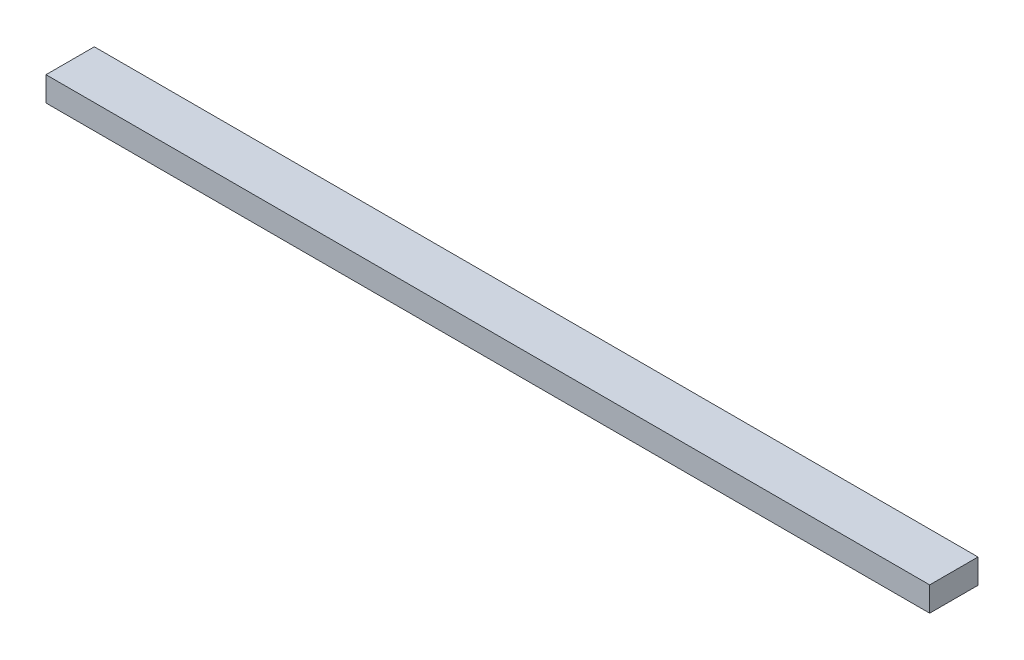
ISO-10303-21;
HEADER;
FILE_DESCRIPTION(('STEP AP214'),'2;1');
FILE_NAME('part.step','',(''),(''),'','','');
FILE_SCHEMA(('AUTOMOTIVE_DESIGN { 1 0 10303 214 1 1 1 1 }'));
ENDSEC;
DATA;
#1=APPLICATION_CONTEXT('core data for automotive mechanical design processes');
#2=APPLICATION_PROTOCOL_DEFINITION('international standard','automotive_design',2000,#1);
#3=PRODUCT_CONTEXT('',#1,'mechanical');
#4=PRODUCT('Part','Part','',(#3));
#5=PRODUCT_RELATED_PRODUCT_CATEGORY('part','',(#4));
#6=PRODUCT_DEFINITION_FORMATION('','',#4);
#7=PRODUCT_DEFINITION_CONTEXT('part definition',#1,'design');
#8=PRODUCT_DEFINITION('design','',#6,#7);
#9=PRODUCT_DEFINITION_SHAPE('','',#8);
#10=(LENGTH_UNIT() NAMED_UNIT(*) SI_UNIT(.MILLI.,.METRE.));
#11=(NAMED_UNIT(*) PLANE_ANGLE_UNIT() SI_UNIT($,.RADIAN.));
#12=(NAMED_UNIT(*) SI_UNIT($,.STERADIAN.) SOLID_ANGLE_UNIT());
#13=UNCERTAINTY_MEASURE_WITH_UNIT(LENGTH_MEASURE(1.E-05),#10,'distance_accuracy_value','');
#14=(GEOMETRIC_REPRESENTATION_CONTEXT(3) GLOBAL_UNCERTAINTY_ASSIGNED_CONTEXT((#13)) GLOBAL_UNIT_ASSIGNED_CONTEXT((#10,
#11,#12)) REPRESENTATION_CONTEXT('',''));
#15=CARTESIAN_POINT('',(0.,0.,0.));
#16=DIRECTION('',(0.,0.,1.));
#17=DIRECTION('',(1.,0.,0.));
#18=AXIS2_PLACEMENT_3D('',#15,#16,#17);
#19=CARTESIAN_POINT('',(-0.254,-0.254,1.));
#20=DIRECTION('',(1.,0.,0.));
#21=DIRECTION('',(0.,0.,-1.));
#22=AXIS2_PLACEMENT_3D('',#19,#20,#21);
#23=PLANE('',#22);
#24=DIRECTION('',(0.,-1.,0.));
#25=VECTOR('',#24,1.);
#26=CARTESIAN_POINT('',(-0.254,-0.254,0.));
#27=LINE('',#26,#25);
#28=CARTESIAN_POINT('',(-0.254,0.254,0.));
#29=VERTEX_POINT('',#28);
#30=CARTESIAN_POINT('',(-0.254,-0.254,0.));
#31=VERTEX_POINT('',#30);
#32=EDGE_CURVE('E95',#29,#31,#27,.T.);
#33=ORIENTED_EDGE('',*,*,#32,.T.);
#34=DIRECTION('',(0.,0.,-1.));
#35=VECTOR('',#34,1.);
#36=CARTESIAN_POINT('',(-0.254,-0.254,1.));
#37=LINE('',#36,#35);
#38=CARTESIAN_POINT('',(-0.254,-0.254,1.));
#39=VERTEX_POINT('',#38);
#40=EDGE_CURVE('E11',#39,#31,#37,.T.);
#41=ORIENTED_EDGE('',*,*,#40,.F.);
#42=DIRECTION('',(0.,-1.,0.));
#43=VECTOR('',#42,1.);
#44=CARTESIAN_POINT('',(-0.254,-0.254,1.));
#45=LINE('',#44,#43);
#46=CARTESIAN_POINT('',(-0.254,0.254,1.));
#47=VERTEX_POINT('',#46);
#48=EDGE_CURVE('E83',#47,#39,#45,.T.);
#49=ORIENTED_EDGE('',*,*,#48,.F.);
#50=DIRECTION('',(0.,0.,-1.));
#51=VECTOR('',#50,1.);
#52=CARTESIAN_POINT('',(-0.254,0.254,1.));
#53=LINE('',#52,#51);
#54=EDGE_CURVE('E91',#47,#29,#53,.T.);
#55=ORIENTED_EDGE('',*,*,#54,.T.);
#56=EDGE_LOOP('',(#33,#41,#49,#55));
#57=FACE_BOUND('',#56,.T.);
#58=ADVANCED_FACE('F32',(#57),#23,.F.);
#59=CARTESIAN_POINT('',(18.034,-0.254,1.));
#60=DIRECTION('',(0.,1.,0.));
#61=DIRECTION('',(0.,0.,1.));
#62=AXIS2_PLACEMENT_3D('',#59,#60,#61);
#63=PLANE('',#62);
#64=DIRECTION('',(1.,0.,0.));
#65=VECTOR('',#64,1.);
#66=CARTESIAN_POINT('',(18.034,-0.254,0.));
#67=LINE('',#66,#65);
#68=CARTESIAN_POINT('',(18.034,-0.254,0.));
#69=VERTEX_POINT('',#68);
#70=EDGE_CURVE('E87',#31,#69,#67,.T.);
#71=ORIENTED_EDGE('',*,*,#70,.T.);
#72=DIRECTION('',(0.,0.,-1.));
#73=VECTOR('',#72,1.);
#74=CARTESIAN_POINT('',(18.034,-0.254,1.));
#75=LINE('',#74,#73);
#76=CARTESIAN_POINT('',(18.034,-0.254,1.));
#77=VERTEX_POINT('',#76);
#78=EDGE_CURVE('E40',#77,#69,#75,.T.);
#79=ORIENTED_EDGE('',*,*,#78,.F.);
#80=DIRECTION('',(1.,0.,0.));
#81=VECTOR('',#80,1.);
#82=CARTESIAN_POINT('',(18.034,-0.254,1.));
#83=LINE('',#82,#81);
#84=EDGE_CURVE('E78',#39,#77,#83,.T.);
#85=ORIENTED_EDGE('',*,*,#84,.F.);
#86=ORIENTED_EDGE('',*,*,#40,.T.);
#87=EDGE_LOOP('',(#71,#79,#85,#86));
#88=FACE_BOUND('',#87,.T.);
#89=ADVANCED_FACE('F86',(#88),#63,.F.);
#90=CARTESIAN_POINT('',(18.034,0.254,1.));
#91=DIRECTION('',(-1.,0.,0.));
#92=DIRECTION('',(0.,0.,1.));
#93=AXIS2_PLACEMENT_3D('',#90,#91,#92);
#94=PLANE('',#93);
#95=DIRECTION('',(0.,1.,0.));
#96=VECTOR('',#95,1.);
#97=CARTESIAN_POINT('',(18.034,0.254,0.));
#98=LINE('',#97,#96);
#99=CARTESIAN_POINT('',(18.034,0.254,0.));
#100=VERTEX_POINT('',#99);
#101=EDGE_CURVE('E65',#69,#100,#98,.T.);
#102=ORIENTED_EDGE('',*,*,#101,.T.);
#103=DIRECTION('',(0.,0.,-1.));
#104=VECTOR('',#103,1.);
#105=CARTESIAN_POINT('',(18.034,0.254,1.));
#106=LINE('',#105,#104);
#107=CARTESIAN_POINT('',(18.034,0.254,1.));
#108=VERTEX_POINT('',#107);
#109=EDGE_CURVE('E88',#108,#100,#106,.T.);
#110=ORIENTED_EDGE('',*,*,#109,.F.);
#111=DIRECTION('',(0.,1.,0.));
#112=VECTOR('',#111,1.);
#113=CARTESIAN_POINT('',(18.034,0.254,1.));
#114=LINE('',#113,#112);
#115=EDGE_CURVE('E81',#77,#108,#114,.T.);
#116=ORIENTED_EDGE('',*,*,#115,.F.);
#117=ORIENTED_EDGE('',*,*,#78,.T.);
#118=EDGE_LOOP('',(#102,#110,#116,#117));
#119=FACE_BOUND('',#118,.T.);
#120=ADVANCED_FACE('F89',(#119),#94,.F.);
#121=CARTESIAN_POINT('',(-0.254,0.254,1.));
#122=DIRECTION('',(0.,-1.,0.));
#123=DIRECTION('',(0.,0.,-1.));
#124=AXIS2_PLACEMENT_3D('',#121,#122,#123);
#125=PLANE('',#124);
#126=DIRECTION('',(-1.,0.,0.));
#127=VECTOR('',#126,1.);
#128=CARTESIAN_POINT('',(-0.254,0.254,0.));
#129=LINE('',#128,#127);
#130=EDGE_CURVE('E71',#100,#29,#129,.T.);
#131=ORIENTED_EDGE('',*,*,#130,.T.);
#132=ORIENTED_EDGE('',*,*,#54,.F.);
#133=DIRECTION('',(-1.,0.,0.));
#134=VECTOR('',#133,1.);
#135=CARTESIAN_POINT('',(-0.254,0.254,1.));
#136=LINE('',#135,#134);
#137=EDGE_CURVE('E48',#108,#47,#136,.T.);
#138=ORIENTED_EDGE('',*,*,#137,.F.);
#139=ORIENTED_EDGE('',*,*,#109,.T.);
#140=EDGE_LOOP('',(#131,#132,#138,#139));
#141=FACE_BOUND('',#140,.T.);
#142=ADVANCED_FACE('F102',(#141),#125,.F.);
#143=CARTESIAN_POINT('',(0.,0.,1.));
#144=DIRECTION('',(0.,0.,-1.));
#145=DIRECTION('',(-1.,0.,0.));
#146=AXIS2_PLACEMENT_3D('',#143,#144,#145);
#147=PLANE('',#146);
#148=ORIENTED_EDGE('',*,*,#48,.T.);
#149=ORIENTED_EDGE('',*,*,#84,.T.);
#150=ORIENTED_EDGE('',*,*,#115,.T.);
#151=ORIENTED_EDGE('',*,*,#137,.T.);
#152=EDGE_LOOP('',(#148,#149,#150,#151));
#153=FACE_BOUND('',#152,.T.);
#154=ADVANCED_FACE('F79',(#153),#147,.F.);
#155=CARTESIAN_POINT('',(0.,0.,0.));
#156=DIRECTION('',(0.,0.,-1.));
#157=DIRECTION('',(-1.,0.,0.));
#158=AXIS2_PLACEMENT_3D('',#155,#156,#157);
#159=PLANE('',#158);
#160=ORIENTED_EDGE('',*,*,#32,.F.);
#161=ORIENTED_EDGE('',*,*,#130,.F.);
#162=ORIENTED_EDGE('',*,*,#101,.F.);
#163=ORIENTED_EDGE('',*,*,#70,.F.);
#164=EDGE_LOOP('',(#160,#161,#162,#163));
#165=FACE_BOUND('',#164,.T.);
#166=ADVANCED_FACE('F105',(#165),#159,.T.);
#167=CLOSED_SHELL('',(#58,#89,#120,#142,#154,#166));
#168=MANIFOLD_SOLID_BREP('B2',#167);
#169=ADVANCED_BREP_SHAPE_REPRESENTATION('',(#18,#168),#14);
#170=SHAPE_DEFINITION_REPRESENTATION(#9,#169);
ENDSEC;
END-ISO-10303-21;
